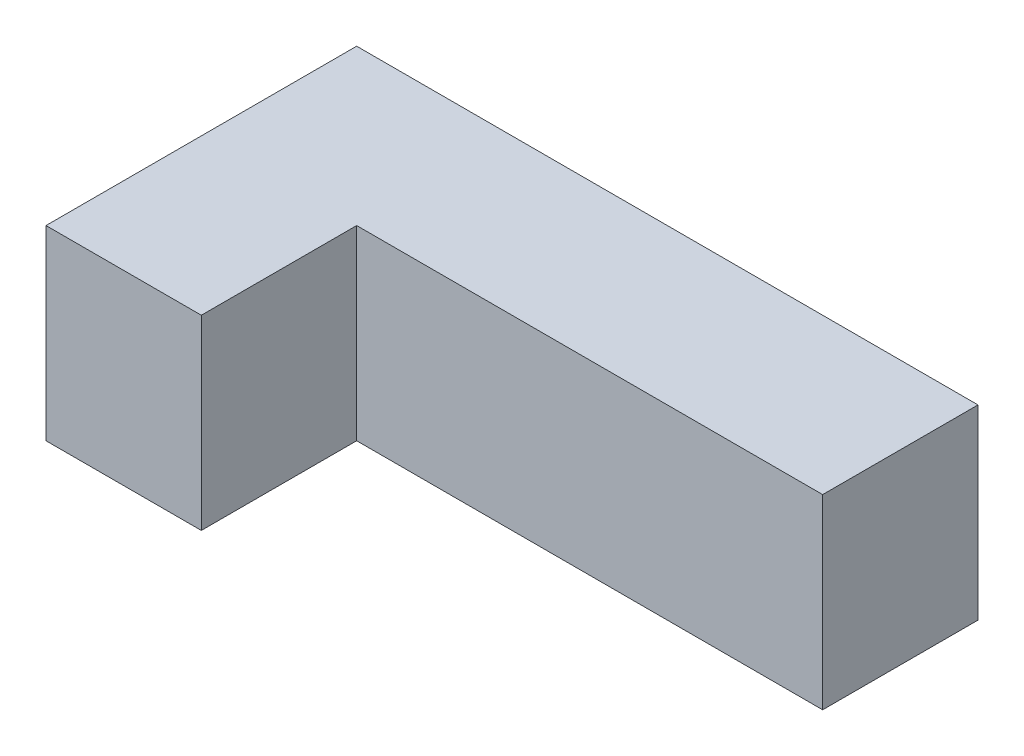
ISO-10303-21;
HEADER;
FILE_DESCRIPTION(('STEP AP214'),'2;1');
FILE_NAME('part.step','',(''),(''),'','','');
FILE_SCHEMA(('AUTOMOTIVE_DESIGN { 1 0 10303 214 1 1 1 1 }'));
ENDSEC;
DATA;
#1=APPLICATION_CONTEXT('core data for automotive mechanical design processes');
#2=APPLICATION_PROTOCOL_DEFINITION('international standard','automotive_design',2000,#1);
#3=PRODUCT_CONTEXT('',#1,'mechanical');
#4=PRODUCT('Part','Part','',(#3));
#5=PRODUCT_RELATED_PRODUCT_CATEGORY('part','',(#4));
#6=PRODUCT_DEFINITION_FORMATION('','',#4);
#7=PRODUCT_DEFINITION_CONTEXT('part definition',#1,'design');
#8=PRODUCT_DEFINITION('design','',#6,#7);
#9=PRODUCT_DEFINITION_SHAPE('','',#8);
#10=(LENGTH_UNIT() NAMED_UNIT(*) SI_UNIT(.MILLI.,.METRE.));
#11=(NAMED_UNIT(*) PLANE_ANGLE_UNIT() SI_UNIT($,.RADIAN.));
#12=(NAMED_UNIT(*) SI_UNIT($,.STERADIAN.) SOLID_ANGLE_UNIT());
#13=UNCERTAINTY_MEASURE_WITH_UNIT(LENGTH_MEASURE(1.E-05),#10,'distance_accuracy_value','');
#14=(GEOMETRIC_REPRESENTATION_CONTEXT(3) GLOBAL_UNCERTAINTY_ASSIGNED_CONTEXT((#13)) GLOBAL_UNIT_ASSIGNED_CONTEXT((#10,
#11,#12)) REPRESENTATION_CONTEXT('',''));
#15=CARTESIAN_POINT('',(0.,0.,0.));
#16=DIRECTION('',(0.,0.,1.));
#17=DIRECTION('',(1.,0.,0.));
#18=AXIS2_PLACEMENT_3D('',#15,#16,#17);
#19=CARTESIAN_POINT('',(25.,30.,0.));
#20=DIRECTION('',(0.,0.,-1.));
#21=DIRECTION('',(-1.,0.,0.));
#22=AXIS2_PLACEMENT_3D('',#19,#20,#21);
#23=PLANE('',#22);
#24=DIRECTION('',(1.,0.,0.));
#25=VECTOR('',#24,1.);
#26=CARTESIAN_POINT('',(25.,0.,0.));
#27=LINE('',#26,#25);
#28=CARTESIAN_POINT('',(0.,0.,0.));
#29=VERTEX_POINT('',#28);
#30=CARTESIAN_POINT('',(25.,0.,0.));
#31=VERTEX_POINT('',#30);
#32=EDGE_CURVE('E128',#29,#31,#27,.T.);
#33=ORIENTED_EDGE('',*,*,#32,.T.);
#34=DIRECTION('',(0.,-1.,0.));
#35=VECTOR('',#34,1.);
#36=CARTESIAN_POINT('',(25.,30.,0.));
#37=LINE('',#36,#35);
#38=CARTESIAN_POINT('',(25.,30.,0.));
#39=VERTEX_POINT('',#38);
#40=EDGE_CURVE('E11',#39,#31,#37,.T.);
#41=ORIENTED_EDGE('',*,*,#40,.F.);
#42=DIRECTION('',(1.,0.,0.));
#43=VECTOR('',#42,1.);
#44=CARTESIAN_POINT('',(25.,30.,0.));
#45=LINE('',#44,#43);
#46=CARTESIAN_POINT('',(0.,30.,0.));
#47=VERTEX_POINT('',#46);
#48=EDGE_CURVE('E144',#47,#39,#45,.T.);
#49=ORIENTED_EDGE('',*,*,#48,.F.);
#50=DIRECTION('',(0.,-1.,0.));
#51=VECTOR('',#50,1.);
#52=CARTESIAN_POINT('',(0.,30.,0.));
#53=LINE('',#52,#51);
#54=EDGE_CURVE('E124',#47,#29,#53,.T.);
#55=ORIENTED_EDGE('',*,*,#54,.T.);
#56=EDGE_LOOP('',(#33,#41,#49,#55));
#57=FACE_BOUND('',#56,.T.);
#58=ADVANCED_FACE('F39',(#57),#23,.F.);
#59=CARTESIAN_POINT('',(25.,30.,-25.));
#60=DIRECTION('',(-1.,0.,0.));
#61=DIRECTION('',(0.,0.,1.));
#62=AXIS2_PLACEMENT_3D('',#59,#60,#61);
#63=PLANE('',#62);
#64=DIRECTION('',(0.,0.,-1.));
#65=VECTOR('',#64,1.);
#66=CARTESIAN_POINT('',(25.,0.,-25.));
#67=LINE('',#66,#65);
#68=CARTESIAN_POINT('',(25.,0.,-25.));
#69=VERTEX_POINT('',#68);
#70=EDGE_CURVE('E132',#31,#69,#67,.T.);
#71=ORIENTED_EDGE('',*,*,#70,.T.);
#72=DIRECTION('',(0.,-1.,0.));
#73=VECTOR('',#72,1.);
#74=CARTESIAN_POINT('',(25.,30.,-25.));
#75=LINE('',#74,#73);
#76=CARTESIAN_POINT('',(25.,30.,-25.));
#77=VERTEX_POINT('',#76);
#78=EDGE_CURVE('E48',#77,#69,#75,.T.);
#79=ORIENTED_EDGE('',*,*,#78,.F.);
#80=DIRECTION('',(0.,0.,-1.));
#81=VECTOR('',#80,1.);
#82=CARTESIAN_POINT('',(25.,30.,-25.));
#83=LINE('',#82,#81);
#84=EDGE_CURVE('E93',#39,#77,#83,.T.);
#85=ORIENTED_EDGE('',*,*,#84,.F.);
#86=ORIENTED_EDGE('',*,*,#40,.T.);
#87=EDGE_LOOP('',(#71,#79,#85,#86));
#88=FACE_BOUND('',#87,.T.);
#89=ADVANCED_FACE('F172',(#88),#63,.F.);
#90=CARTESIAN_POINT('',(100.,30.,-25.));
#91=DIRECTION('',(0.,0.,-1.));
#92=DIRECTION('',(-1.,0.,0.));
#93=AXIS2_PLACEMENT_3D('',#90,#91,#92);
#94=PLANE('',#93);
#95=DIRECTION('',(1.,0.,0.));
#96=VECTOR('',#95,1.);
#97=CARTESIAN_POINT('',(100.,0.,-25.));
#98=LINE('',#97,#96);
#99=CARTESIAN_POINT('',(100.,0.,-25.));
#100=VERTEX_POINT('',#99);
#101=EDGE_CURVE('E135',#69,#100,#98,.T.);
#102=ORIENTED_EDGE('',*,*,#101,.T.);
#103=DIRECTION('',(0.,-1.,0.));
#104=VECTOR('',#103,1.);
#105=CARTESIAN_POINT('',(100.,30.,-25.));
#106=LINE('',#105,#104);
#107=CARTESIAN_POINT('',(100.,30.,-25.));
#108=VERTEX_POINT('',#107);
#109=EDGE_CURVE('E117',#108,#100,#106,.T.);
#110=ORIENTED_EDGE('',*,*,#109,.F.);
#111=DIRECTION('',(1.,0.,0.));
#112=VECTOR('',#111,1.);
#113=CARTESIAN_POINT('',(100.,30.,-25.));
#114=LINE('',#113,#112);
#115=EDGE_CURVE('E106',#77,#108,#114,.T.);
#116=ORIENTED_EDGE('',*,*,#115,.F.);
#117=ORIENTED_EDGE('',*,*,#78,.T.);
#118=EDGE_LOOP('',(#102,#110,#116,#117));
#119=FACE_BOUND('',#118,.T.);
#120=ADVANCED_FACE('F154',(#119),#94,.F.);
#121=CARTESIAN_POINT('',(100.,30.,-50.));
#122=DIRECTION('',(-1.,0.,0.));
#123=DIRECTION('',(0.,0.,1.));
#124=AXIS2_PLACEMENT_3D('',#121,#122,#123);
#125=PLANE('',#124);
#126=DIRECTION('',(0.,0.,-1.));
#127=VECTOR('',#126,1.);
#128=CARTESIAN_POINT('',(100.,0.,-50.));
#129=LINE('',#128,#127);
#130=CARTESIAN_POINT('',(100.,0.,-50.));
#131=VERTEX_POINT('',#130);
#132=EDGE_CURVE('E115',#100,#131,#129,.T.);
#133=ORIENTED_EDGE('',*,*,#132,.T.);
#134=DIRECTION('',(0.,-1.,0.));
#135=VECTOR('',#134,1.);
#136=CARTESIAN_POINT('',(100.,30.,-50.));
#137=LINE('',#136,#135);
#138=CARTESIAN_POINT('',(100.,30.,-50.));
#139=VERTEX_POINT('',#138);
#140=EDGE_CURVE('E112',#139,#131,#137,.T.);
#141=ORIENTED_EDGE('',*,*,#140,.F.);
#142=DIRECTION('',(0.,0.,-1.));
#143=VECTOR('',#142,1.);
#144=CARTESIAN_POINT('',(100.,30.,-50.));
#145=LINE('',#144,#143);
#146=EDGE_CURVE('E100',#108,#139,#145,.T.);
#147=ORIENTED_EDGE('',*,*,#146,.F.);
#148=ORIENTED_EDGE('',*,*,#109,.T.);
#149=EDGE_LOOP('',(#133,#141,#147,#148));
#150=FACE_BOUND('',#149,.T.);
#151=ADVANCED_FACE('F113',(#150),#125,.F.);
#152=CARTESIAN_POINT('',(0.,30.,-50.));
#153=DIRECTION('',(0.,0.,1.));
#154=DIRECTION('',(1.,0.,0.));
#155=AXIS2_PLACEMENT_3D('',#152,#153,#154);
#156=PLANE('',#155);
#157=DIRECTION('',(-1.,0.,0.));
#158=VECTOR('',#157,1.);
#159=CARTESIAN_POINT('',(0.,0.,-50.));
#160=LINE('',#159,#158);
#161=CARTESIAN_POINT('',(0.,0.,-50.));
#162=VERTEX_POINT('',#161);
#163=EDGE_CURVE('E79',#131,#162,#160,.T.);
#164=ORIENTED_EDGE('',*,*,#163,.T.);
#165=DIRECTION('',(0.,-1.,0.));
#166=VECTOR('',#165,1.);
#167=CARTESIAN_POINT('',(0.,30.,-50.));
#168=LINE('',#167,#166);
#169=CARTESIAN_POINT('',(0.,30.,-50.));
#170=VERTEX_POINT('',#169);
#171=EDGE_CURVE('E118',#170,#162,#168,.T.);
#172=ORIENTED_EDGE('',*,*,#171,.F.);
#173=DIRECTION('',(-1.,0.,0.));
#174=VECTOR('',#173,1.);
#175=CARTESIAN_POINT('',(0.,30.,-50.));
#176=LINE('',#175,#174);
#177=EDGE_CURVE('E104',#139,#170,#176,.T.);
#178=ORIENTED_EDGE('',*,*,#177,.F.);
#179=ORIENTED_EDGE('',*,*,#140,.T.);
#180=EDGE_LOOP('',(#164,#172,#178,#179));
#181=FACE_BOUND('',#180,.T.);
#182=ADVANCED_FACE('F120',(#181),#156,.F.);
#183=CARTESIAN_POINT('',(0.,30.,0.));
#184=DIRECTION('',(1.,0.,0.));
#185=DIRECTION('',(0.,0.,-1.));
#186=AXIS2_PLACEMENT_3D('',#183,#184,#185);
#187=PLANE('',#186);
#188=DIRECTION('',(0.,0.,1.));
#189=VECTOR('',#188,1.);
#190=CARTESIAN_POINT('',(0.,0.,0.));
#191=LINE('',#190,#189);
#192=EDGE_CURVE('E85',#162,#29,#191,.T.);
#193=ORIENTED_EDGE('',*,*,#192,.T.);
#194=ORIENTED_EDGE('',*,*,#54,.F.);
#195=DIRECTION('',(0.,0.,1.));
#196=VECTOR('',#195,1.);
#197=CARTESIAN_POINT('',(0.,30.,0.));
#198=LINE('',#197,#196);
#199=EDGE_CURVE('E56',#170,#47,#198,.T.);
#200=ORIENTED_EDGE('',*,*,#199,.F.);
#201=ORIENTED_EDGE('',*,*,#171,.T.);
#202=EDGE_LOOP('',(#193,#194,#200,#201));
#203=FACE_BOUND('',#202,.T.);
#204=ADVANCED_FACE('F161',(#203),#187,.F.);
#205=CARTESIAN_POINT('',(0.,30.,0.));
#206=DIRECTION('',(0.,-1.,0.));
#207=DIRECTION('',(0.,0.,-1.));
#208=AXIS2_PLACEMENT_3D('',#205,#206,#207);
#209=PLANE('',#208);
#210=ORIENTED_EDGE('',*,*,#48,.T.);
#211=ORIENTED_EDGE('',*,*,#84,.T.);
#212=ORIENTED_EDGE('',*,*,#115,.T.);
#213=ORIENTED_EDGE('',*,*,#146,.T.);
#214=ORIENTED_EDGE('',*,*,#177,.T.);
#215=ORIENTED_EDGE('',*,*,#199,.T.);
#216=EDGE_LOOP('',(#210,#211,#212,#213,#214,#215));
#217=FACE_BOUND('',#216,.T.);
#218=ADVANCED_FACE('F102',(#217),#209,.F.);
#219=CARTESIAN_POINT('',(0.,0.,0.));
#220=DIRECTION('',(0.,-1.,0.));
#221=DIRECTION('',(0.,0.,-1.));
#222=AXIS2_PLACEMENT_3D('',#219,#220,#221);
#223=PLANE('',#222);
#224=ORIENTED_EDGE('',*,*,#32,.F.);
#225=ORIENTED_EDGE('',*,*,#192,.F.);
#226=ORIENTED_EDGE('',*,*,#163,.F.);
#227=ORIENTED_EDGE('',*,*,#132,.F.);
#228=ORIENTED_EDGE('',*,*,#101,.F.);
#229=ORIENTED_EDGE('',*,*,#70,.F.);
#230=EDGE_LOOP('',(#224,#225,#226,#227,#228,#229));
#231=FACE_BOUND('',#230,.T.);
#232=ADVANCED_FACE('F157',(#231),#223,.T.);
#233=CLOSED_SHELL('',(#58,#89,#120,#151,#182,#204,#218,#232));
#234=MANIFOLD_SOLID_BREP('B2',#233);
#235=ADVANCED_BREP_SHAPE_REPRESENTATION('',(#18,#234),#14);
#236=SHAPE_DEFINITION_REPRESENTATION(#9,#235);
ENDSEC;
END-ISO-10303-21;
